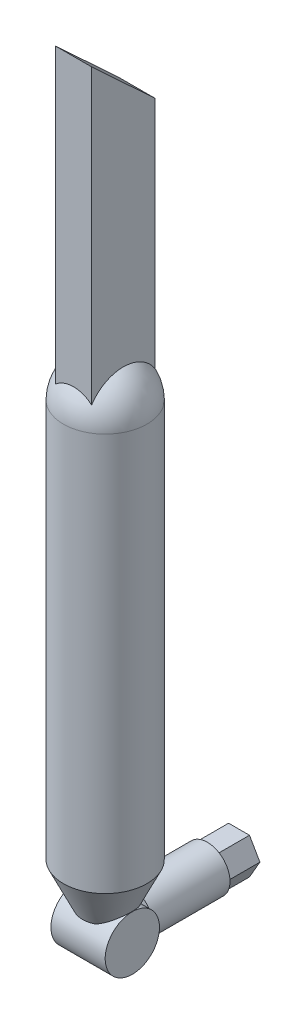
ISO-10303-21;
HEADER;
FILE_DESCRIPTION(('STEP AP214'),'2;1');
FILE_NAME('part.step','',(''),(''),'','','');
FILE_SCHEMA(('AUTOMOTIVE_DESIGN { 1 0 10303 214 1 1 1 1 }'));
ENDSEC;
DATA;
#1=APPLICATION_CONTEXT('core data for automotive mechanical design processes');
#2=APPLICATION_PROTOCOL_DEFINITION('international standard','automotive_design',2000,#1);
#3=PRODUCT_CONTEXT('',#1,'mechanical');
#4=PRODUCT('Part','Part','',(#3));
#5=PRODUCT_RELATED_PRODUCT_CATEGORY('part','',(#4));
#6=PRODUCT_DEFINITION_FORMATION('','',#4);
#7=PRODUCT_DEFINITION_CONTEXT('part definition',#1,'design');
#8=PRODUCT_DEFINITION('design','',#6,#7);
#9=PRODUCT_DEFINITION_SHAPE('','',#8);
#10=(LENGTH_UNIT() NAMED_UNIT(*) SI_UNIT(.MILLI.,.METRE.));
#11=(NAMED_UNIT(*) PLANE_ANGLE_UNIT() SI_UNIT($,.RADIAN.));
#12=(NAMED_UNIT(*) SI_UNIT($,.STERADIAN.) SOLID_ANGLE_UNIT());
#13=UNCERTAINTY_MEASURE_WITH_UNIT(LENGTH_MEASURE(1.E-05),#10,'distance_accuracy_value','');
#14=(GEOMETRIC_REPRESENTATION_CONTEXT(3) GLOBAL_UNCERTAINTY_ASSIGNED_CONTEXT((#13)) GLOBAL_UNIT_ASSIGNED_CONTEXT((#10,
#11,#12)) REPRESENTATION_CONTEXT('',''));
#15=CARTESIAN_POINT('',(0.,0.,0.));
#16=DIRECTION('',(0.,0.,1.));
#17=DIRECTION('',(1.,0.,0.));
#18=AXIS2_PLACEMENT_3D('',#15,#16,#17);
#19=CARTESIAN_POINT('',(0.,101.,29.6));
#20=DIRECTION('',(0.,-1.,0.));
#21=DIRECTION('',(0.,0.,1.));
#22=AXIS2_PLACEMENT_3D('',#19,#20,#21);
#23=SPHERICAL_SURFACE('',#22,9.25);
#24=CARTESIAN_POINT('',(0.,101.,29.6));
#25=DIRECTION('',(0.,-1.,0.));
#26=DIRECTION('',(0.,0.,-1.));
#27=AXIS2_PLACEMENT_3D('',#24,#25,#26);
#28=CIRCLE('',#27,9.25);
#29=CARTESIAN_POINT('',(0.,101.,20.35));
#30=VERTEX_POINT('',#29);
#31=EDGE_CURVE('E145',#30,#30,#28,.T.);
#32=ORIENTED_EDGE('',*,*,#31,.F.);
#33=EDGE_LOOP('',(#32));
#34=FACE_BOUND('',#33,.T.);
#35=CARTESIAN_POINT('',(4.,101.,29.6));
#36=DIRECTION('',(-1.,0.,0.));
#37=DIRECTION('',(0.,0.,1.));
#38=AXIS2_PLACEMENT_3D('',#35,#36,#37);
#39=CIRCLE('',#38,8.34041365880614);
#40=CARTESIAN_POINT('',(4.,105.534589286804,36.6));
#41=VERTEX_POINT('',#40);
#42=CARTESIAN_POINT('',(4.,105.534589286804,22.6));
#43=VERTEX_POINT('',#42);
#44=EDGE_CURVE('E12',#41,#43,#39,.T.);
#45=ORIENTED_EDGE('',*,*,#44,.F.);
#46=CARTESIAN_POINT('',(0.,101.,36.6));
#47=DIRECTION('',(0.,0.,-1.));
#48=DIRECTION('',(-1.,0.,0.));
#49=AXIS2_PLACEMENT_3D('',#46,#47,#48);
#50=CIRCLE('',#49,6.04669331122391);
#51=CARTESIAN_POINT('',(-4.,105.534589286804,36.6));
#52=VERTEX_POINT('',#51);
#53=EDGE_CURVE('E235',#52,#41,#50,.T.);
#54=ORIENTED_EDGE('',*,*,#53,.F.);
#55=CARTESIAN_POINT('',(-4.,101.,29.6));
#56=DIRECTION('',(-1.,0.,0.));
#57=DIRECTION('',(0.,0.,1.));
#58=AXIS2_PLACEMENT_3D('',#55,#56,#57);
#59=CIRCLE('',#58,8.34041365880614);
#60=CARTESIAN_POINT('',(-4.,105.534589286804,22.6));
#61=VERTEX_POINT('',#60);
#62=EDGE_CURVE('E231',#52,#61,#59,.T.);
#63=ORIENTED_EDGE('',*,*,#62,.T.);
#64=CARTESIAN_POINT('',(0.,101.,22.6));
#65=DIRECTION('',(0.,0.,1.));
#66=DIRECTION('',(1.,0.,0.));
#67=AXIS2_PLACEMENT_3D('',#64,#65,#66);
#68=CIRCLE('',#67,6.04669331122391);
#69=EDGE_CURVE('E65',#43,#61,#68,.T.);
#70=ORIENTED_EDGE('',*,*,#69,.F.);
#71=EDGE_LOOP('',(#45,#54,#63,#70));
#72=FACE_BOUND('',#71,.T.);
#73=ADVANCED_FACE('F55',(#34,#72),#23,.T.);
#74=CARTESIAN_POINT('',(6.,0.,29.6));
#75=DIRECTION('',(-1.,0.,0.));
#76=DIRECTION('',(0.,0.,1.));
#77=AXIS2_PLACEMENT_3D('',#74,#75,#76);
#78=CYLINDRICAL_SURFACE('',#77,6.);
#79=CARTESIAN_POINT('',(-6.,0.,29.6));
#80=DIRECTION('',(1.,0.,0.));
#81=DIRECTION('',(0.,0.,-1.));
#82=AXIS2_PLACEMENT_3D('',#79,#80,#81);
#83=CIRCLE('',#82,6.);
#84=CARTESIAN_POINT('',(-6.,0.,23.6));
#85=VERTEX_POINT('',#84);
#86=EDGE_CURVE('E168',#85,#85,#83,.T.);
#87=ORIENTED_EDGE('',*,*,#86,.T.);
#88=EDGE_LOOP('',(#87));
#89=FACE_BOUND('',#88,.T.);
#90=CARTESIAN_POINT('',(6.,0.,29.6));
#91=DIRECTION('',(1.,0.,0.));
#92=DIRECTION('',(0.,0.,-1.));
#93=AXIS2_PLACEMENT_3D('',#90,#91,#92);
#94=CIRCLE('',#93,6.);
#95=CARTESIAN_POINT('',(6.,0.,23.6));
#96=VERTEX_POINT('',#95);
#97=EDGE_CURVE('E163',#96,#96,#94,.T.);
#98=ORIENTED_EDGE('',*,*,#97,.F.);
#99=EDGE_LOOP('',(#98));
#100=FACE_BOUND('',#99,.T.);
#101=DIRECTION('',(-1.,0.,0.));
#102=VECTOR('',#101,1.);
#103=CARTESIAN_POINT('',(6.,2.15406592285379,24.));
#104=LINE('',#103,#102);
#105=CARTESIAN_POINT('',(-4.51220566907139,2.15406592285379,24.));
#106=VERTEX_POINT('',#105);
#107=CARTESIAN_POINT('',(4.51220566907139,2.15406592285379,24.));
#108=VERTEX_POINT('',#107);
#109=EDGE_CURVE('E210',#106,#108,#104,.F.);
#110=ORIENTED_EDGE('',*,*,#109,.F.);
#111=CARTESIAN_POINT('',(-4.51220566907139,2.15406592285379,24.));
#112=CARTESIAN_POINT('',(-4.55894658187828,2.05617724840622,23.9623344891867));
#113=CARTESIAN_POINT('',(-4.60281722188025,1.95606426604625,23.926784247778));
#114=CARTESIAN_POINT('',(-4.68438416390731,1.75175050764121,23.8604111204532));
#115=CARTESIAN_POINT('',(-4.72207599983695,1.64754684165553,23.8295916549995));
#116=CARTESIAN_POINT('',(-4.79086483458632,1.43530196514214,23.7731654255681));
#117=CARTESIAN_POINT('',(-4.8219458958981,1.32725219755523,23.7475712647783));
#118=CARTESIAN_POINT('',(-4.87695508746984,1.10817789116757,23.7021657472854));
#119=CARTESIAN_POINT('',(-4.90088492402655,0.997154068882254,23.6823530111491));
#120=CARTESIAN_POINT('',(-4.94131913491131,0.772314641589159,23.6488230902611));
#121=CARTESIAN_POINT('',(-4.95778924538453,0.658488636498177,23.6351340361495));
#122=CARTESIAN_POINT('',(-4.98286154880554,0.429381662830633,23.614278605395));
#123=CARTESIAN_POINT('',(-4.991464108371,0.314100762304129,23.6071119248182));
#124=CARTESIAN_POINT('',(-5.00064029656251,0.0832021547746377,23.5994669435459));
#125=CARTESIAN_POINT('',(-5.00122811739833,-0.0324145941765744,23.5989768202456));
#126=CARTESIAN_POINT('',(-4.99440040401746,-0.263238009526529,23.6046658352037));
#127=CARTESIAN_POINT('',(-4.98698551809346,-0.37844470838461,23.6108444332346));
#128=CARTESIAN_POINT('',(-4.9649413161458,-0.600940654284703,23.6291870249387));
#129=CARTESIAN_POINT('',(-4.95075141800852,-0.708304204611178,23.6409863700389));
#130=CARTESIAN_POINT('',(-4.91559267857415,-0.921190861293861,23.6701639870322));
#131=CARTESIAN_POINT('',(-4.89462093266647,-1.02671315861006,23.6875446493361));
#132=CARTESIAN_POINT('',(-4.84619877711982,-1.23523984362846,23.7275680529534));
#133=CARTESIAN_POINT('',(-4.81874798459369,-1.33824408212575,23.7502111052532));
#134=CARTESIAN_POINT('',(-4.75772175562083,-1.54120505179415,23.8003780647821));
#135=CARTESIAN_POINT('',(-4.72414614180932,-1.64116169461404,23.8279021133564));
#136=CARTESIAN_POINT('',(-4.66131589891433,-1.81049507105174,23.8791929387623));
#137=CARTESIAN_POINT('',(-4.63342213282214,-1.88070482916018,23.9019034310214));
#138=CARTESIAN_POINT('',(-4.57486420996215,-2.01896985863824,23.949416586012));
#139=CARTESIAN_POINT('',(-4.54420842076003,-2.08703084635873,23.9742129154828));
#140=CARTESIAN_POINT('',(-4.51220566907142,-2.1540659228538,24.));
#141=B_SPLINE_CURVE_WITH_KNOTS('',3,(#111,#112,#113,#114,#115,#116,#117,#118,#119,#120,#121,
#122,#123,#124,#125,#126,#127,#128,#129,#130,#131,#132,#133,#134,#135,#136,#137,#138,#139,#140),
.UNSPECIFIED.,.F.,.F.,(4,2,2,2,2,2,2,2,2,2,2,2,2,2,4),(0.,0.344460156339406,0.689168204131238,
1.0346980967844,1.38014547935627,1.72716386083323,2.07416607087935,2.42055374198497,
2.76691335461597,3.0933541686693,3.41993498026733,3.74653509639143,4.07314467182107,
4.30970661523619,4.54557455686185),.UNSPECIFIED.);
#142=CARTESIAN_POINT('',(-4.51220566907139,-2.15406592285379,24.));
#143=VERTEX_POINT('',#142);
#144=EDGE_CURVE('E167',#106,#143,#141,.T.);
#145=ORIENTED_EDGE('',*,*,#144,.T.);
#146=DIRECTION('',(-1.,0.,0.));
#147=VECTOR('',#146,1.);
#148=CARTESIAN_POINT('',(6.,-2.15406592285379,24.));
#149=LINE('',#148,#147);
#150=CARTESIAN_POINT('',(4.51220566907139,-2.15406592285379,24.));
#151=VERTEX_POINT('',#150);
#152=EDGE_CURVE('E296',#151,#143,#149,.T.);
#153=ORIENTED_EDGE('',*,*,#152,.F.);
#154=CARTESIAN_POINT('',(4.51220566907139,-2.15406592285379,24.));
#155=CARTESIAN_POINT('',(4.55894658187828,-2.05617724840622,23.9623344891867));
#156=CARTESIAN_POINT('',(4.60281722188025,-1.95606426604625,23.926784247778));
#157=CARTESIAN_POINT('',(4.68438416390731,-1.75175050764121,23.8604111204532));
#158=CARTESIAN_POINT('',(4.72207599983695,-1.64754684165553,23.8295916549995));
#159=CARTESIAN_POINT('',(4.79086483458632,-1.43530196514214,23.7731654255681));
#160=CARTESIAN_POINT('',(4.8219458958981,-1.32725219755523,23.7475712647783));
#161=CARTESIAN_POINT('',(4.87695508746984,-1.10817789116757,23.7021657472854));
#162=CARTESIAN_POINT('',(4.90088492402655,-0.997154068882254,23.6823530111491));
#163=CARTESIAN_POINT('',(4.94131913491131,-0.772314641589159,23.6488230902611));
#164=CARTESIAN_POINT('',(4.95778924538453,-0.658488636498177,23.6351340361495));
#165=CARTESIAN_POINT('',(4.98286154880554,-0.429381662830633,23.614278605395));
#166=CARTESIAN_POINT('',(4.991464108371,-0.314100762304129,23.6071119248182));
#167=CARTESIAN_POINT('',(5.00064029656251,-0.0832021547746377,23.5994669435459));
#168=CARTESIAN_POINT('',(5.00122811739833,0.0324145941765744,23.5989768202456));
#169=CARTESIAN_POINT('',(4.99440040401746,0.263238009526529,23.6046658352037));
#170=CARTESIAN_POINT('',(4.98698551809346,0.37844470838461,23.6108444332346));
#171=CARTESIAN_POINT('',(4.9649413161458,0.600940654284703,23.6291870249387));
#172=CARTESIAN_POINT('',(4.95075141800852,0.708304204611178,23.6409863700389));
#173=CARTESIAN_POINT('',(4.91559267857415,0.921190861293861,23.6701639870322));
#174=CARTESIAN_POINT('',(4.89462093266647,1.02671315861006,23.6875446493361));
#175=CARTESIAN_POINT('',(4.84619877711982,1.23523984362846,23.7275680529534));
#176=CARTESIAN_POINT('',(4.81874798459369,1.33824408212575,23.7502111052532));
#177=CARTESIAN_POINT('',(4.75772175562083,1.54120505179415,23.8003780647821));
#178=CARTESIAN_POINT('',(4.72414614180932,1.64116169461404,23.8279021133564));
#179=CARTESIAN_POINT('',(4.66131589891433,1.81049507105174,23.8791929387623));
#180=CARTESIAN_POINT('',(4.63342213282214,1.88070482916018,23.9019034310214));
#181=CARTESIAN_POINT('',(4.57486420996215,2.01896985863824,23.949416586012));
#182=CARTESIAN_POINT('',(4.54420842076003,2.08703084635873,23.9742129154828));
#183=CARTESIAN_POINT('',(4.51220566907142,2.1540659228538,24.));
#184=B_SPLINE_CURVE_WITH_KNOTS('',3,(#154,#155,#156,#157,#158,#159,#160,#161,#162,#163,#164,
#165,#166,#167,#168,#169,#170,#171,#172,#173,#174,#175,#176,#177,#178,#179,#180,#181,#182,#183),
.UNSPECIFIED.,.F.,.F.,(4,2,2,2,2,2,2,2,2,2,2,2,2,2,4),(0.,0.344460156339406,0.689168204131238,
1.0346980967844,1.38014547935627,1.72716386083323,2.07416607087935,2.42055374198497,
2.76691335461597,3.0933541686693,3.41993498026733,3.74653509639143,4.07314467182107,
4.30970661523619,4.54557455686185),.UNSPECIFIED.);
#185=EDGE_CURVE('E179',#151,#108,#184,.T.);
#186=ORIENTED_EDGE('',*,*,#185,.T.);
#187=EDGE_LOOP('',(#110,#145,#153,#186));
#188=FACE_BOUND('',#187,.T.);
#189=CARTESIAN_POINT('',(2.23549896096495,3.9998,34.0723148323883));
#190=CARTESIAN_POINT('',(2.32077695911365,4.0297727340832,34.0455087192463));
#191=CARTESIAN_POINT('',(2.40514867293773,4.06087838578132,34.0171472507727));
#192=CARTESIAN_POINT('',(2.57202345309472,4.12501601331814,33.9573118714882));
#193=CARTESIAN_POINT('',(2.65452675235518,4.15804774718422,33.9258383512984));
#194=CARTESIAN_POINT('',(2.89920490112097,4.25954433108321,33.8267270408121));
#195=CARTESIAN_POINT('',(3.05852368208579,4.33040183383517,33.7544061338386));
#196=CARTESIAN_POINT('',(3.37031402810598,4.47659133693451,33.5964755545473));
#197=CARTESIAN_POINT('',(3.52271293886908,4.55195724609816,33.5107544655088));
#198=CARTESIAN_POINT('',(3.81848905889785,4.70424290768612,33.3261793899309));
#199=CARTESIAN_POINT('',(3.96186865216539,4.78116224234469,33.2273288954559));
#200=CARTESIAN_POINT('',(4.20882583427235,4.9178134097646,33.0388344421946));
#201=CARTESIAN_POINT('',(4.31432127044238,4.97767634249664,32.9517984837724));
#202=CARTESIAN_POINT('',(4.51854129449492,5.09589781868021,32.7691756480427));
#203=CARTESIAN_POINT('',(4.61726419154319,5.15425598419775,32.6735866490073));
#204=CARTESIAN_POINT('',(4.90140395868331,5.32498040715015,32.3743690495578));
#205=CARTESIAN_POINT('',(5.07578193453171,5.4335569509897,32.1575484026198));
#206=CARTESIAN_POINT('',(5.34700421040212,5.60584011009224,31.7473137564259));
#207=CARTESIAN_POINT('',(5.45235135073301,5.6739960062222,31.5614355773967));
#208=CARTESIAN_POINT('',(5.59005994627605,5.76401087336521,31.2693098235971));
#209=CARTESIAN_POINT('',(5.63259005835426,5.79198784378392,31.1696751014314));
#210=CARTESIAN_POINT('',(5.71021949596007,5.84327661444368,30.9664143046666));
#211=CARTESIAN_POINT('',(5.74532225092089,5.86659056746617,30.8627900983705));
#212=CARTESIAN_POINT('',(5.80777966667446,5.90820641175384,30.6511150766422));
#213=CARTESIAN_POINT('',(5.83505650915663,5.92645790796374,30.5430312575172));
#214=CARTESIAN_POINT('',(5.88082842719612,5.95715055482269,30.3242569331868));
#215=CARTESIAN_POINT('',(5.89932806675235,5.96959472512886,30.2135678141923));
#216=CARTESIAN_POINT('',(5.92713468312164,5.98831922360297,29.9905706399691));
#217=CARTESIAN_POINT('',(5.93644590159506,5.99460239587031,29.8782633560521));
#218=CARTESIAN_POINT('',(5.94566272103673,6.00082176979776,29.6530960959905));
#219=CARTESIAN_POINT('',(5.94556956502471,6.00075881025548,29.5402361948599));
#220=CARTESIAN_POINT('',(5.93664937537803,5.99473978358574,29.3307392532896));
#221=CARTESIAN_POINT('',(5.92903627830118,5.98960281153037,29.2340245679092));
#222=CARTESIAN_POINT('',(5.90698776864724,5.97475072230426,29.0417219338285));
#223=CARTESIAN_POINT('',(5.89255026865776,5.9650342043688,28.946134339052));
#224=CARTESIAN_POINT('',(5.83933927872918,5.92930479163222,28.662115766321));
#225=CARTESIAN_POINT('',(5.79065946762815,5.89670662540619,28.4762586933838));
#226=CARTESIAN_POINT('',(5.66911099515966,5.81601743245621,28.1137406822301));
#227=CARTESIAN_POINT('',(5.59594806317048,5.76773814755615,27.937223444437));
#228=CARTESIAN_POINT('',(5.42921593394217,5.65905160977754,27.598288066676));
#229=CARTESIAN_POINT('',(5.33564290073514,5.59864207725437,27.4358725850898));
#230=CARTESIAN_POINT('',(5.07621753402394,5.43380527823193,27.0425523279098));
#231=CARTESIAN_POINT('',(4.8985921648198,5.32320311603824,26.8219190781896));
#232=CARTESIAN_POINT('',(4.60882038080533,5.14922886521492,26.5179187981851));
#233=CARTESIAN_POINT('',(4.50803812224498,5.08972129974374,26.4208525949438));
#234=CARTESIAN_POINT('',(4.29947609292952,4.96919131511184,26.2355797984152));
#235=CARTESIAN_POINT('',(4.19169835163956,4.90816933844316,26.1473706543465));
#236=CARTESIAN_POINT('',(3.94345948258987,4.77121839636627,25.9596705061593));
#237=CARTESIAN_POINT('',(3.80131677214171,4.69519209400643,25.8624778949338));
#238=CARTESIAN_POINT('',(3.50823961865649,4.54473866717709,25.6809119167985));
#239=CARTESIAN_POINT('',(3.35730312966443,4.47031192041726,25.5965415497132));
#240=CARTESIAN_POINT('',(3.04880233696912,4.32603490676154,25.4410884625336));
#241=CARTESIAN_POINT('',(2.89131688152684,4.25614713401708,25.3698843559733));
#242=CARTESIAN_POINT('',(2.56888896921659,4.12265307786046,25.2396728734774));
#243=CARTESIAN_POINT('',(2.4039485462212,4.05904509608929,25.1806621951048));
#244=CARTESIAN_POINT('',(2.23549896096495,3.9998,25.1276851676118));
#245=B_SPLINE_CURVE_WITH_KNOTS('',3,(#189,#190,#191,#192,#193,#194,#195,#196,#197,#198,#199,
#200,#201,#202,#203,#204,#205,#206,#207,#208,#209,#210,#211,#212,#213,#214,#215,#216,#217,#218,
#219,#220,#221,#222,#223,#224,#225,#226,#227,#228,#229,#230,#231,#232,#233,#234,#235,#236,#237,
#238,#239,#240,#241,#242,#243,#244),.UNSPECIFIED.,.F.,.F.,(4,2,2,2,2,2,2,2,2,2,2,2,2,2,2,2,2,2,
2,2,2,2,2,2,2,2,2,4),(0.,0.282793787819684,0.565552124639248,1.13114935901986,1.70172743206057,
2.27215404963195,2.71963038386059,3.16721803163293,4.05835986345071,4.72844205791103,
5.06374437188509,5.3988915272518,5.73726411444646,6.07546056019066,6.41350081082274,
6.75149638116845,7.04258280998519,7.33375833245658,7.91560422162818,8.50471093131596,
9.09392845596651,10.0007460951063,10.4566131780949,10.9123485951793,11.4763552173151,
12.0404935889962,12.5991387645612,13.1576324391966),.UNSPECIFIED.);
#246=CARTESIAN_POINT('',(2.23606797749979,4.,34.0721359549996));
#247=VERTEX_POINT('',#246);
#248=CARTESIAN_POINT('',(2.23606797749979,4.,25.1278640450004));
#249=VERTEX_POINT('',#248);
#250=EDGE_CURVE('E224',#247,#249,#245,.T.);
#251=ORIENTED_EDGE('',*,*,#250,.F.);
#252=DIRECTION('',(-1.,0.,0.));
#253=VECTOR('',#252,1.);
#254=CARTESIAN_POINT('',(6.,4.,34.0721359549996));
#255=LINE('',#254,#253);
#256=CARTESIAN_POINT('',(-2.23606797749979,4.,34.0721359549996));
#257=VERTEX_POINT('',#256);
#258=EDGE_CURVE('E209',#257,#247,#255,.F.);
#259=ORIENTED_EDGE('',*,*,#258,.F.);
#260=CARTESIAN_POINT('',(-2.23549896096493,3.9998,25.1276851676117));
#261=CARTESIAN_POINT('',(-2.32077695911364,4.0297727340832,25.1544912807537));
#262=CARTESIAN_POINT('',(-2.40514867293772,4.06087838578131,25.1828527492273));
#263=CARTESIAN_POINT('',(-2.57202345309471,4.12501601331813,25.2426881285118));
#264=CARTESIAN_POINT('',(-2.65452675235516,4.15804774718422,25.2741616487016));
#265=CARTESIAN_POINT('',(-2.89920490112096,4.25954433108321,25.3732729591879));
#266=CARTESIAN_POINT('',(-3.05852368208578,4.33040183383516,25.4455938661613));
#267=CARTESIAN_POINT('',(-3.37031402810597,4.47659133693451,25.6035244454527));
#268=CARTESIAN_POINT('',(-3.52271293886907,4.55195724609815,25.6892455344912));
#269=CARTESIAN_POINT('',(-3.81848905889784,4.70424290768611,25.8738206100691));
#270=CARTESIAN_POINT('',(-3.96186865216538,4.78116224234469,25.9726711045441));
#271=CARTESIAN_POINT('',(-4.20882583427234,4.91781340976459,26.1611655578054));
#272=CARTESIAN_POINT('',(-4.31432127044238,4.97767634249663,26.2482015162276));
#273=CARTESIAN_POINT('',(-4.51854129449492,5.0958978186802,26.4308243519573));
#274=CARTESIAN_POINT('',(-4.61726419154319,5.15425598419774,26.5264133509927));
#275=CARTESIAN_POINT('',(-4.90140395868331,5.32498040715015,26.8256309504421));
#276=CARTESIAN_POINT('',(-5.07578193453171,5.43355695098969,27.0424515973802));
#277=CARTESIAN_POINT('',(-5.34700421040211,5.60584011009223,27.4526862435741));
#278=CARTESIAN_POINT('',(-5.452351350733,5.6739960062222,27.6385644226033));
#279=CARTESIAN_POINT('',(-5.59005994627605,5.76401087336521,27.9306901764029));
#280=CARTESIAN_POINT('',(-5.63259005835426,5.79198784378392,28.0303248985686));
#281=CARTESIAN_POINT('',(-5.71021949596007,5.84327661444368,28.2335856953334));
#282=CARTESIAN_POINT('',(-5.74532225092089,5.86659056746617,28.3372099016295));
#283=CARTESIAN_POINT('',(-5.80777966667445,5.90820641175384,28.5488849233578));
#284=CARTESIAN_POINT('',(-5.83505650915662,5.92645790796374,28.6569687424828));
#285=CARTESIAN_POINT('',(-5.88082842719612,5.95715055482269,28.8757430668132));
#286=CARTESIAN_POINT('',(-5.89932806675235,5.96959472512886,28.9864321858077));
#287=CARTESIAN_POINT('',(-5.92713468312164,5.98831922360297,29.2094293600309));
#288=CARTESIAN_POINT('',(-5.93644590159506,5.99460239587031,29.3217366439479));
#289=CARTESIAN_POINT('',(-5.94566272103673,6.00082176979776,29.5469039040095));
#290=CARTESIAN_POINT('',(-5.94556956502471,6.00075881025548,29.6597638051401));
#291=CARTESIAN_POINT('',(-5.93664937537803,5.99473978358574,29.8692607467103));
#292=CARTESIAN_POINT('',(-5.92903627830118,5.98960281153037,29.9659754320908));
#293=CARTESIAN_POINT('',(-5.90698776864724,5.97475072230426,30.1582780661715));
#294=CARTESIAN_POINT('',(-5.89255026865776,5.9650342043688,30.253865660948));
#295=CARTESIAN_POINT('',(-5.83933927872918,5.92930479163222,30.537884233679));
#296=CARTESIAN_POINT('',(-5.79065946762815,5.89670662540619,30.7237413066162));
#297=CARTESIAN_POINT('',(-5.66911099515966,5.81601743245621,31.0862593177699));
#298=CARTESIAN_POINT('',(-5.59594806317048,5.76773814755615,31.262776555563));
#299=CARTESIAN_POINT('',(-5.42921593394217,5.65905160977754,31.601711933324));
#300=CARTESIAN_POINT('',(-5.33564290073514,5.59864207725437,31.7641274149102));
#301=CARTESIAN_POINT('',(-5.07621753402394,5.43380527823193,32.1574476720902));
#302=CARTESIAN_POINT('',(-4.89859216481981,5.32320311603824,32.3780809218104));
#303=CARTESIAN_POINT('',(-4.60882038080533,5.14922886521493,32.6820812018149));
#304=CARTESIAN_POINT('',(-4.50803812224498,5.08972129974375,32.7791474050562));
#305=CARTESIAN_POINT('',(-4.29947609292952,4.96919131511184,32.9644202015848));
#306=CARTESIAN_POINT('',(-4.19169835163956,4.90816933844316,33.0526293456535));
#307=CARTESIAN_POINT('',(-3.94345948258987,4.77121839636627,33.2403294938407));
#308=CARTESIAN_POINT('',(-3.80131677214172,4.69519209400643,33.3375221050662));
#309=CARTESIAN_POINT('',(-3.50823961865649,4.54473866717709,33.5190880832015));
#310=CARTESIAN_POINT('',(-3.35730312966443,4.47031192041726,33.6034584502868));
#311=CARTESIAN_POINT('',(-3.04880233696912,4.32603490676154,33.7589115374664));
#312=CARTESIAN_POINT('',(-2.89131688152684,4.25614713401708,33.8301156440267));
#313=CARTESIAN_POINT('',(-2.56888896921659,4.12265307786045,33.9603271265226));
#314=CARTESIAN_POINT('',(-2.40394854622119,4.05904509608929,34.0193378048952));
#315=CARTESIAN_POINT('',(-2.23549896096494,3.9998,34.0723148323883));
#316=B_SPLINE_CURVE_WITH_KNOTS('',3,(#260,#261,#262,#263,#264,#265,#266,#267,#268,#269,#270,
#271,#272,#273,#274,#275,#276,#277,#278,#279,#280,#281,#282,#283,#284,#285,#286,#287,#288,#289,
#290,#291,#292,#293,#294,#295,#296,#297,#298,#299,#300,#301,#302,#303,#304,#305,#306,#307,#308,
#309,#310,#311,#312,#313,#314,#315),.UNSPECIFIED.,.F.,.F.,(4,2,2,2,2,2,2,2,2,2,2,2,2,2,2,2,2,2,
2,2,2,2,2,2,2,2,2,4),(0.,0.282793787819682,0.565552124639245,1.13114935901986,1.70172743206057,
2.27215404963195,2.71963038386059,3.16721803163293,4.05835986345071,4.72844205791103,
5.0637443718851,5.39889152725181,5.73726411444646,6.07546056019066,6.41350081082275,
6.75149638116846,7.0425828099852,7.33375833245659,7.91560422162819,8.50471093131596,
9.09392845596652,10.0007460951063,10.4566131780949,10.9123485951793,11.4763552173152,
12.0404935889962,12.5991387645612,13.1576324391966),.UNSPECIFIED.);
#317=CARTESIAN_POINT('',(-2.23606797749979,4.,25.1278640450004));
#318=VERTEX_POINT('',#317);
#319=EDGE_CURVE('E199',#318,#257,#316,.T.);
#320=ORIENTED_EDGE('',*,*,#319,.F.);
#321=DIRECTION('',(-1.,0.,0.));
#322=VECTOR('',#321,1.);
#323=CARTESIAN_POINT('',(6.,4.,25.1278640450004));
#324=LINE('',#323,#322);
#325=EDGE_CURVE('E80',#249,#318,#324,.T.);
#326=ORIENTED_EDGE('',*,*,#325,.F.);
#327=EDGE_LOOP('',(#251,#259,#320,#326));
#328=FACE_BOUND('',#327,.T.);
#329=ADVANCED_FACE('F185',(#89,#100,#188,#328),#78,.T.);
#330=CARTESIAN_POINT('',(0.,0.,24.));
#331=DIRECTION('',(0.,0.,-1.));
#332=DIRECTION('',(-1.,0.,0.));
#333=AXIS2_PLACEMENT_3D('',#330,#331,#332);
#334=CYLINDRICAL_SURFACE('',#333,5.);
#335=CARTESIAN_POINT('',(0.,0.,7.));
#336=DIRECTION('',(0.,0.,1.));
#337=DIRECTION('',(1.,0.,0.));
#338=AXIS2_PLACEMENT_3D('',#335,#336,#337);
#339=CIRCLE('',#338,5.);
#340=CARTESIAN_POINT('',(5.,0.,7.));
#341=VERTEX_POINT('',#340);
#342=EDGE_CURVE('E286',#341,#341,#339,.T.);
#343=ORIENTED_EDGE('',*,*,#342,.T.);
#344=EDGE_LOOP('',(#343));
#345=FACE_BOUND('',#344,.T.);
#346=ORIENTED_EDGE('',*,*,#185,.F.);
#347=CARTESIAN_POINT('',(0.,0.,24.));
#348=DIRECTION('',(0.,0.,1.));
#349=DIRECTION('',(1.,0.,0.));
#350=AXIS2_PLACEMENT_3D('',#347,#348,#349);
#351=CIRCLE('',#350,5.);
#352=EDGE_CURVE('E289',#143,#151,#351,.T.);
#353=ORIENTED_EDGE('',*,*,#352,.F.);
#354=ORIENTED_EDGE('',*,*,#144,.F.);
#355=EDGE_CURVE('E293',#108,#106,#351,.T.);
#356=ORIENTED_EDGE('',*,*,#355,.F.);
#357=EDGE_LOOP('',(#346,#353,#354,#356));
#358=FACE_BOUND('',#357,.T.);
#359=ADVANCED_FACE('F57',(#345,#358),#334,.T.);
#360=CARTESIAN_POINT('',(0.,0.,24.));
#361=DIRECTION('',(0.,0.,1.));
#362=DIRECTION('',(1.,0.,0.));
#363=AXIS2_PLACEMENT_3D('',#360,#361,#362);
#364=PLANE('',#363);
#365=ORIENTED_EDGE('',*,*,#355,.T.);
#366=ORIENTED_EDGE('',*,*,#109,.T.);
#367=EDGE_LOOP('',(#365,#366));
#368=FACE_BOUND('',#367,.T.);
#369=ADVANCED_FACE('F193',(#368),#364,.T.);
#370=ORIENTED_EDGE('',*,*,#352,.T.);
#371=ORIENTED_EDGE('',*,*,#152,.T.);
#372=EDGE_LOOP('',(#370,#371));
#373=FACE_BOUND('',#372,.T.);
#374=ADVANCED_FACE('F326',(#373),#364,.T.);
#375=CARTESIAN_POINT('',(0.,0.,7.));
#376=DIRECTION('',(0.,0.,1.));
#377=DIRECTION('',(1.,0.,0.));
#378=AXIS2_PLACEMENT_3D('',#375,#376,#377);
#379=PLANE('',#378);
#380=ORIENTED_EDGE('',*,*,#342,.F.);
#381=EDGE_LOOP('',(#380));
#382=FACE_BOUND('',#381,.T.);
#383=ADVANCED_FACE('F313',(#382),#379,.F.);
#384=CARTESIAN_POINT('',(6.,0.,29.6));
#385=DIRECTION('',(1.,0.,0.));
#386=DIRECTION('',(0.,0.,-1.));
#387=AXIS2_PLACEMENT_3D('',#384,#385,#386);
#388=PLANE('',#387);
#389=ORIENTED_EDGE('',*,*,#97,.T.);
#390=EDGE_LOOP('',(#389));
#391=FACE_BOUND('',#390,.T.);
#392=ADVANCED_FACE('F308',(#391),#388,.T.);
#393=CARTESIAN_POINT('',(-6.,0.,29.6));
#394=DIRECTION('',(1.,0.,0.));
#395=DIRECTION('',(0.,0.,-1.));
#396=AXIS2_PLACEMENT_3D('',#393,#394,#395);
#397=PLANE('',#396);
#398=ORIENTED_EDGE('',*,*,#86,.F.);
#399=EDGE_LOOP('',(#398));
#400=FACE_BOUND('',#399,.T.);
#401=ADVANCED_FACE('F191',(#400),#397,.F.);
#402=CARTESIAN_POINT('',(0.,4.,29.6));
#403=DIRECTION('',(0.,1.,0.));
#404=DIRECTION('',(0.,0.,1.));
#405=AXIS2_PLACEMENT_3D('',#402,#403,#404);
#406=PLANE('',#405);
#407=CARTESIAN_POINT('',(0.,4.,29.6));
#408=DIRECTION('',(0.,-1.,0.));
#409=DIRECTION('',(0.,0.,-1.));
#410=AXIS2_PLACEMENT_3D('',#407,#408,#409);
#411=CIRCLE('',#410,5.);
#412=EDGE_CURVE('E158',#318,#249,#411,.T.);
#413=ORIENTED_EDGE('',*,*,#412,.T.);
#414=ORIENTED_EDGE('',*,*,#325,.T.);
#415=EDGE_LOOP('',(#413,#414));
#416=FACE_BOUND('',#415,.T.);
#417=ADVANCED_FACE('F222',(#416),#406,.F.);
#418=EDGE_CURVE('E162',#247,#257,#411,.T.);
#419=ORIENTED_EDGE('',*,*,#418,.T.);
#420=ORIENTED_EDGE('',*,*,#258,.T.);
#421=EDGE_LOOP('',(#419,#420));
#422=FACE_BOUND('',#421,.T.);
#423=ADVANCED_FACE('F219',(#422),#406,.F.);
#424=CARTESIAN_POINT('',(0.,13.,29.6));
#425=DIRECTION('',(0.,1.,0.));
#426=DIRECTION('',(0.,0.,1.));
#427=AXIS2_PLACEMENT_3D('',#424,#425,#426);
#428=CONICAL_SURFACE('',#427,9.25,0.441179480414981);
#429=CARTESIAN_POINT('',(0.,13.,29.6));
#430=DIRECTION('',(0.,-1.,0.));
#431=DIRECTION('',(0.,0.,-1.));
#432=AXIS2_PLACEMENT_3D('',#429,#430,#431);
#433=CIRCLE('',#432,9.25);
#434=CARTESIAN_POINT('',(0.,13.,20.35));
#435=VERTEX_POINT('',#434);
#436=EDGE_CURVE('E150',#435,#435,#433,.T.);
#437=ORIENTED_EDGE('',*,*,#436,.T.);
#438=EDGE_LOOP('',(#437));
#439=FACE_BOUND('',#438,.T.);
#440=ORIENTED_EDGE('',*,*,#418,.F.);
#441=ORIENTED_EDGE('',*,*,#250,.T.);
#442=ORIENTED_EDGE('',*,*,#412,.F.);
#443=ORIENTED_EDGE('',*,*,#319,.T.);
#444=EDGE_LOOP('',(#440,#441,#442,#443));
#445=FACE_BOUND('',#444,.T.);
#446=ADVANCED_FACE('F213',(#439,#445),#428,.T.);
#447=CARTESIAN_POINT('',(0.,2.,29.6));
#448=DIRECTION('',(0.,-1.,0.));
#449=DIRECTION('',(0.,0.,-1.));
#450=AXIS2_PLACEMENT_3D('',#447,#448,#449);
#451=CYLINDRICAL_SURFACE('',#450,9.25);
#452=ORIENTED_EDGE('',*,*,#436,.F.);
#453=EDGE_LOOP('',(#452));
#454=FACE_BOUND('',#453,.T.);
#455=ORIENTED_EDGE('',*,*,#31,.T.);
#456=EDGE_LOOP('',(#455));
#457=FACE_BOUND('',#456,.T.);
#458=ADVANCED_FACE('F218',(#454,#457),#451,.T.);
#459=CARTESIAN_POINT('',(4.,157.3,22.6));
#460=DIRECTION('',(0.,0.,1.));
#461=DIRECTION('',(1.,0.,0.));
#462=AXIS2_PLACEMENT_3D('',#459,#460,#461);
#463=PLANE('',#462);
#464=DIRECTION('',(0.,1.,0.));
#465=VECTOR('',#464,1.);
#466=CARTESIAN_POINT('',(4.,157.3,22.6));
#467=LINE('',#466,#465);
#468=CARTESIAN_POINT('',(4.,157.3,22.6));
#469=VERTEX_POINT('',#468);
#470=EDGE_CURVE('E120',#43,#469,#467,.T.);
#471=ORIENTED_EDGE('',*,*,#470,.F.);
#472=ORIENTED_EDGE('',*,*,#69,.T.);
#473=DIRECTION('',(0.,1.,0.));
#474=VECTOR('',#473,1.);
#475=CARTESIAN_POINT('',(-4.,157.3,22.6));
#476=LINE('',#475,#474);
#477=CARTESIAN_POINT('',(-4.,157.3,22.6));
#478=VERTEX_POINT('',#477);
#479=EDGE_CURVE('E72',#61,#478,#476,.T.);
#480=ORIENTED_EDGE('',*,*,#479,.T.);
#481=DIRECTION('',(-1.,0.,0.));
#482=VECTOR('',#481,1.);
#483=CARTESIAN_POINT('',(4.,157.3,22.6));
#484=LINE('',#483,#482);
#485=EDGE_CURVE('E136',#469,#478,#484,.T.);
#486=ORIENTED_EDGE('',*,*,#485,.F.);
#487=EDGE_LOOP('',(#471,#472,#480,#486));
#488=FACE_BOUND('',#487,.T.);
#489=ADVANCED_FACE('F143',(#488),#463,.F.);
#490=CARTESIAN_POINT('',(4.,170.3,36.6));
#491=DIRECTION('',(0.,-0.7327934916263,0.680451099367277));
#492=DIRECTION('',(0.,-0.680451099367277,-0.7327934916263));
#493=AXIS2_PLACEMENT_3D('',#490,#491,#492);
#494=PLANE('',#493);
#495=DIRECTION('',(0.,0.680451099367277,0.7327934916263));
#496=VECTOR('',#495,1.);
#497=CARTESIAN_POINT('',(-4.,170.3,36.6));
#498=LINE('',#497,#496);
#499=CARTESIAN_POINT('',(-4.,170.3,36.6));
#500=VERTEX_POINT('',#499);
#501=EDGE_CURVE('E246',#478,#500,#498,.T.);
#502=ORIENTED_EDGE('',*,*,#501,.T.);
#503=DIRECTION('',(-1.,0.,0.));
#504=VECTOR('',#503,1.);
#505=CARTESIAN_POINT('',(4.,170.3,36.6));
#506=LINE('',#505,#504);
#507=CARTESIAN_POINT('',(4.,170.3,36.6));
#508=VERTEX_POINT('',#507);
#509=EDGE_CURVE('E138',#508,#500,#506,.T.);
#510=ORIENTED_EDGE('',*,*,#509,.F.);
#511=DIRECTION('',(0.,0.680451099367277,0.7327934916263));
#512=VECTOR('',#511,1.);
#513=CARTESIAN_POINT('',(4.,170.3,36.6));
#514=LINE('',#513,#512);
#515=EDGE_CURVE('E124',#469,#508,#514,.T.);
#516=ORIENTED_EDGE('',*,*,#515,.F.);
#517=ORIENTED_EDGE('',*,*,#485,.T.);
#518=EDGE_LOOP('',(#502,#510,#516,#517));
#519=FACE_BOUND('',#518,.T.);
#520=ADVANCED_FACE('F135',(#519),#494,.F.);
#521=CARTESIAN_POINT('',(4.,95.,36.6));
#522=DIRECTION('',(0.,0.,-1.));
#523=DIRECTION('',(-1.,0.,0.));
#524=AXIS2_PLACEMENT_3D('',#521,#522,#523);
#525=PLANE('',#524);
#526=DIRECTION('',(0.,-1.,0.));
#527=VECTOR('',#526,1.);
#528=CARTESIAN_POINT('',(-4.,95.,36.6));
#529=LINE('',#528,#527);
#530=EDGE_CURVE('E131',#500,#52,#529,.T.);
#531=ORIENTED_EDGE('',*,*,#530,.T.);
#532=ORIENTED_EDGE('',*,*,#53,.T.);
#533=DIRECTION('',(0.,-1.,0.));
#534=VECTOR('',#533,1.);
#535=CARTESIAN_POINT('',(4.,95.,36.6));
#536=LINE('',#535,#534);
#537=EDGE_CURVE('E141',#508,#41,#536,.T.);
#538=ORIENTED_EDGE('',*,*,#537,.F.);
#539=ORIENTED_EDGE('',*,*,#509,.T.);
#540=EDGE_LOOP('',(#531,#532,#538,#539));
#541=FACE_BOUND('',#540,.T.);
#542=ADVANCED_FACE('F244',(#541),#525,.F.);
#543=CARTESIAN_POINT('',(4.,0.,0.));
#544=DIRECTION('',(-1.,0.,0.));
#545=DIRECTION('',(0.,0.,1.));
#546=AXIS2_PLACEMENT_3D('',#543,#544,#545);
#547=PLANE('',#546);
#548=ORIENTED_EDGE('',*,*,#537,.T.);
#549=ORIENTED_EDGE('',*,*,#44,.T.);
#550=ORIENTED_EDGE('',*,*,#470,.T.);
#551=ORIENTED_EDGE('',*,*,#515,.T.);
#552=EDGE_LOOP('',(#548,#549,#550,#551));
#553=FACE_BOUND('',#552,.T.);
#554=ADVANCED_FACE('F123',(#553),#547,.F.);
#555=CARTESIAN_POINT('',(-4.,0.,0.));
#556=DIRECTION('',(-1.,0.,0.));
#557=DIRECTION('',(0.,0.,1.));
#558=AXIS2_PLACEMENT_3D('',#555,#556,#557);
#559=PLANE('',#558);
#560=ORIENTED_EDGE('',*,*,#62,.F.);
#561=ORIENTED_EDGE('',*,*,#530,.F.);
#562=ORIENTED_EDGE('',*,*,#501,.F.);
#563=ORIENTED_EDGE('',*,*,#479,.F.);
#564=EDGE_LOOP('',(#560,#561,#562,#563));
#565=FACE_BOUND('',#564,.T.);
#566=ADVANCED_FACE('F242',(#565),#559,.T.);
#567=CLOSED_SHELL('',(#73,#329,#359,#369,#374,#383,#392,#401,#417,#423,#446,#458,#489,#520,#542,
#554,#566));
#568=MANIFOLD_SOLID_BREP('B2',#567);
#569=CARTESIAN_POINT('',(2.3094010767585,-4.,7.));
#570=DIRECTION('',(-0.866025403784438,0.5,0.));
#571=DIRECTION('',(-0.5,-0.866025403784439,0.));
#572=AXIS2_PLACEMENT_3D('',#569,#570,#571);
#573=PLANE('',#572);
#574=DIRECTION('',(0.5,0.866025403784438,0.));
#575=VECTOR('',#574,1.);
#576=CARTESIAN_POINT('',(2.3094010767585,-4.,0.));
#577=LINE('',#576,#575);
#578=CARTESIAN_POINT('',(2.3094010767585,-4.,0.));
#579=VERTEX_POINT('',#578);
#580=CARTESIAN_POINT('',(4.61880215351701,0.,0.));
#581=VERTEX_POINT('',#580);
#582=EDGE_CURVE('E547',#579,#581,#577,.T.);
#583=ORIENTED_EDGE('',*,*,#582,.T.);
#584=DIRECTION('',(0.,0.,-1.));
#585=VECTOR('',#584,1.);
#586=CARTESIAN_POINT('',(4.61880215351701,0.,7.));
#587=LINE('',#586,#585);
#588=CARTESIAN_POINT('',(4.61880215351701,0.,7.));
#589=VERTEX_POINT('',#588);
#590=EDGE_CURVE('E53',#589,#581,#587,.T.);
#591=ORIENTED_EDGE('',*,*,#590,.F.);
#592=DIRECTION('',(0.5,0.866025403784438,0.));
#593=VECTOR('',#592,1.);
#594=CARTESIAN_POINT('',(2.3094010767585,-4.,7.));
#595=LINE('',#594,#593);
#596=CARTESIAN_POINT('',(2.3094010767585,-4.,7.));
#597=VERTEX_POINT('',#596);
#598=EDGE_CURVE('E558',#597,#589,#595,.T.);
#599=ORIENTED_EDGE('',*,*,#598,.F.);
#600=DIRECTION('',(0.,0.,-1.));
#601=VECTOR('',#600,1.);
#602=CARTESIAN_POINT('',(2.3094010767585,-4.,7.));
#603=LINE('',#602,#601);
#604=EDGE_CURVE('E543',#597,#579,#603,.T.);
#605=ORIENTED_EDGE('',*,*,#604,.T.);
#606=EDGE_LOOP('',(#583,#591,#599,#605));
#607=FACE_BOUND('',#606,.T.);
#608=ADVANCED_FACE('F463',(#607),#573,.F.);
#609=CARTESIAN_POINT('',(4.61880215351701,0.,7.));
#610=DIRECTION('',(-0.866025403784439,-0.5,0.));
#611=DIRECTION('',(0.5,-0.866025403784439,0.));
#612=AXIS2_PLACEMENT_3D('',#609,#610,#611);
#613=PLANE('',#612);
#614=DIRECTION('',(-0.5,0.866025403784439,0.));
#615=VECTOR('',#614,1.);
#616=CARTESIAN_POINT('',(4.61880215351701,0.,0.));
#617=LINE('',#616,#615);
#618=CARTESIAN_POINT('',(2.3094010767585,4.,0.));
#619=VERTEX_POINT('',#618);
#620=EDGE_CURVE('E550',#581,#619,#617,.T.);
#621=ORIENTED_EDGE('',*,*,#620,.T.);
#622=DIRECTION('',(0.,0.,-1.));
#623=VECTOR('',#622,1.);
#624=CARTESIAN_POINT('',(2.3094010767585,4.,7.));
#625=LINE('',#624,#623);
#626=CARTESIAN_POINT('',(2.3094010767585,4.,7.));
#627=VERTEX_POINT('',#626);
#628=EDGE_CURVE('E471',#627,#619,#625,.T.);
#629=ORIENTED_EDGE('',*,*,#628,.F.);
#630=DIRECTION('',(-0.5,0.866025403784439,0.));
#631=VECTOR('',#630,1.);
#632=CARTESIAN_POINT('',(4.61880215351701,0.,7.));
#633=LINE('',#632,#631);
#634=EDGE_CURVE('E516',#589,#627,#633,.T.);
#635=ORIENTED_EDGE('',*,*,#634,.F.);
#636=ORIENTED_EDGE('',*,*,#590,.T.);
#637=EDGE_LOOP('',(#621,#629,#635,#636));
#638=FACE_BOUND('',#637,.T.);
#639=ADVANCED_FACE('F582',(#638),#613,.F.);
#640=CARTESIAN_POINT('',(2.3094010767585,4.,7.));
#641=DIRECTION('',(0.,-1.,0.));
#642=DIRECTION('',(1.,0.,0.));
#643=AXIS2_PLACEMENT_3D('',#640,#641,#642);
#644=PLANE('',#643);
#645=DIRECTION('',(-1.,0.,0.));
#646=VECTOR('',#645,1.);
#647=CARTESIAN_POINT('',(2.3094010767585,4.,0.));
#648=LINE('',#647,#646);
#649=CARTESIAN_POINT('',(-2.3094010767585,4.,0.));
#650=VERTEX_POINT('',#649);
#651=EDGE_CURVE('E553',#619,#650,#648,.T.);
#652=ORIENTED_EDGE('',*,*,#651,.T.);
#653=DIRECTION('',(0.,0.,-1.));
#654=VECTOR('',#653,1.);
#655=CARTESIAN_POINT('',(-2.3094010767585,4.,7.));
#656=LINE('',#655,#654);
#657=CARTESIAN_POINT('',(-2.3094010767585,4.,7.));
#658=VERTEX_POINT('',#657);
#659=EDGE_CURVE('E538',#658,#650,#656,.T.);
#660=ORIENTED_EDGE('',*,*,#659,.F.);
#661=DIRECTION('',(-1.,0.,0.));
#662=VECTOR('',#661,1.);
#663=CARTESIAN_POINT('',(2.3094010767585,4.,7.));
#664=LINE('',#663,#662);
#665=EDGE_CURVE('E529',#627,#658,#664,.T.);
#666=ORIENTED_EDGE('',*,*,#665,.F.);
#667=ORIENTED_EDGE('',*,*,#628,.T.);
#668=EDGE_LOOP('',(#652,#660,#666,#667));
#669=FACE_BOUND('',#668,.T.);
#670=ADVANCED_FACE('F564',(#669),#644,.F.);
#671=CARTESIAN_POINT('',(-2.3094010767585,4.,7.));
#672=DIRECTION('',(0.866025403784438,-0.5,0.));
#673=DIRECTION('',(0.5,0.866025403784439,0.));
#674=AXIS2_PLACEMENT_3D('',#671,#672,#673);
#675=PLANE('',#674);
#676=DIRECTION('',(-0.5,-0.866025403784439,0.));
#677=VECTOR('',#676,1.);
#678=CARTESIAN_POINT('',(-2.3094010767585,4.,0.));
#679=LINE('',#678,#677);
#680=CARTESIAN_POINT('',(-4.61880215351701,0.,0.));
#681=VERTEX_POINT('',#680);
#682=EDGE_CURVE('E537',#650,#681,#679,.T.);
#683=ORIENTED_EDGE('',*,*,#682,.T.);
#684=DIRECTION('',(0.,0.,-1.));
#685=VECTOR('',#684,1.);
#686=CARTESIAN_POINT('',(-4.61880215351701,0.,7.));
#687=LINE('',#686,#685);
#688=CARTESIAN_POINT('',(-4.61880215351701,0.,7.));
#689=VERTEX_POINT('',#688);
#690=EDGE_CURVE('E534',#689,#681,#687,.T.);
#691=ORIENTED_EDGE('',*,*,#690,.F.);
#692=DIRECTION('',(-0.5,-0.866025403784439,0.));
#693=VECTOR('',#692,1.);
#694=CARTESIAN_POINT('',(-2.3094010767585,4.,7.));
#695=LINE('',#694,#693);
#696=EDGE_CURVE('E523',#658,#689,#695,.T.);
#697=ORIENTED_EDGE('',*,*,#696,.F.);
#698=ORIENTED_EDGE('',*,*,#659,.T.);
#699=EDGE_LOOP('',(#683,#691,#697,#698));
#700=FACE_BOUND('',#699,.T.);
#701=ADVANCED_FACE('F535',(#700),#675,.F.);
#702=CARTESIAN_POINT('',(-4.61880215351701,0.,7.));
#703=DIRECTION('',(0.866025403784439,0.5,0.));
#704=DIRECTION('',(-0.5,0.866025403784439,0.));
#705=AXIS2_PLACEMENT_3D('',#702,#703,#704);
#706=PLANE('',#705);
#707=DIRECTION('',(0.5,-0.866025403784439,0.));
#708=VECTOR('',#707,1.);
#709=CARTESIAN_POINT('',(-4.61880215351701,0.,0.));
#710=LINE('',#709,#708);
#711=CARTESIAN_POINT('',(-2.30940107675851,-4.,0.));
#712=VERTEX_POINT('',#711);
#713=EDGE_CURVE('E502',#681,#712,#710,.T.);
#714=ORIENTED_EDGE('',*,*,#713,.T.);
#715=DIRECTION('',(0.,0.,-1.));
#716=VECTOR('',#715,1.);
#717=CARTESIAN_POINT('',(-2.30940107675851,-4.,7.));
#718=LINE('',#717,#716);
#719=CARTESIAN_POINT('',(-2.30940107675851,-4.,7.));
#720=VERTEX_POINT('',#719);
#721=EDGE_CURVE('E539',#720,#712,#718,.T.);
#722=ORIENTED_EDGE('',*,*,#721,.F.);
#723=DIRECTION('',(0.5,-0.866025403784439,0.));
#724=VECTOR('',#723,1.);
#725=CARTESIAN_POINT('',(-4.61880215351701,0.,7.));
#726=LINE('',#725,#724);
#727=EDGE_CURVE('E527',#689,#720,#726,.T.);
#728=ORIENTED_EDGE('',*,*,#727,.F.);
#729=ORIENTED_EDGE('',*,*,#690,.T.);
#730=EDGE_LOOP('',(#714,#722,#728,#729));
#731=FACE_BOUND('',#730,.T.);
#732=ADVANCED_FACE('F541',(#731),#706,.F.);
#733=CARTESIAN_POINT('',(-2.30940107675851,-4.,7.));
#734=DIRECTION('',(0.,1.,0.));
#735=DIRECTION('',(-1.,0.,0.));
#736=AXIS2_PLACEMENT_3D('',#733,#734,#735);
#737=PLANE('',#736);
#738=DIRECTION('',(1.,0.,0.));
#739=VECTOR('',#738,1.);
#740=CARTESIAN_POINT('',(-2.30940107675851,-4.,0.));
#741=LINE('',#740,#739);
#742=EDGE_CURVE('E508',#712,#579,#741,.T.);
#743=ORIENTED_EDGE('',*,*,#742,.T.);
#744=ORIENTED_EDGE('',*,*,#604,.F.);
#745=DIRECTION('',(1.,0.,0.));
#746=VECTOR('',#745,1.);
#747=CARTESIAN_POINT('',(-2.30940107675851,-4.,7.));
#748=LINE('',#747,#746);
#749=EDGE_CURVE('E479',#720,#597,#748,.T.);
#750=ORIENTED_EDGE('',*,*,#749,.F.);
#751=ORIENTED_EDGE('',*,*,#721,.T.);
#752=EDGE_LOOP('',(#743,#744,#750,#751));
#753=FACE_BOUND('',#752,.T.);
#754=ADVANCED_FACE('F571',(#753),#737,.F.);
#755=CARTESIAN_POINT('',(0.,0.,7.));
#756=DIRECTION('',(0.,0.,1.));
#757=DIRECTION('',(1.,0.,0.));
#758=AXIS2_PLACEMENT_3D('',#755,#756,#757);
#759=PLANE('',#758);
#760=ORIENTED_EDGE('',*,*,#598,.T.);
#761=ORIENTED_EDGE('',*,*,#634,.T.);
#762=ORIENTED_EDGE('',*,*,#665,.T.);
#763=ORIENTED_EDGE('',*,*,#696,.T.);
#764=ORIENTED_EDGE('',*,*,#727,.T.);
#765=ORIENTED_EDGE('',*,*,#749,.T.);
#766=EDGE_LOOP('',(#760,#761,#762,#763,#764,#765));
#767=FACE_BOUND('',#766,.T.);
#768=ADVANCED_FACE('F525',(#767),#759,.T.);
#769=CARTESIAN_POINT('',(0.,0.,0.));
#770=DIRECTION('',(0.,0.,1.));
#771=DIRECTION('',(1.,0.,0.));
#772=AXIS2_PLACEMENT_3D('',#769,#770,#771);
#773=PLANE('',#772);
#774=CARTESIAN_POINT('',(0.,0.,0.));
#775=DIRECTION('',(0.,0.,1.));
#776=DIRECTION('',(1.,0.,0.));
#777=AXIS2_PLACEMENT_3D('',#774,#775,#776);
#778=CIRCLE('',#777,3.175);
#779=CARTESIAN_POINT('',(3.175,0.,0.));
#780=VERTEX_POINT('',#779);
#781=EDGE_CURVE('E678',#780,#780,#778,.T.);
#782=ORIENTED_EDGE('',*,*,#781,.T.);
#783=EDGE_LOOP('',(#782));
#784=FACE_BOUND('',#783,.T.);
#785=ORIENTED_EDGE('',*,*,#582,.F.);
#786=ORIENTED_EDGE('',*,*,#742,.F.);
#787=ORIENTED_EDGE('',*,*,#713,.F.);
#788=ORIENTED_EDGE('',*,*,#682,.F.);
#789=ORIENTED_EDGE('',*,*,#651,.F.);
#790=ORIENTED_EDGE('',*,*,#620,.F.);
#791=EDGE_LOOP('',(#785,#786,#787,#788,#789,#790));
#792=FACE_BOUND('',#791,.T.);
#793=ADVANCED_FACE('F567',(#784,#792),#773,.F.);
#794=CARTESIAN_POINT('',(0.,0.,5.));
#795=DIRECTION('',(0.,0.,-1.));
#796=DIRECTION('',(-1.,0.,0.));
#797=AXIS2_PLACEMENT_3D('',#794,#795,#796);
#798=CYLINDRICAL_SURFACE('',#797,3.175);
#799=CARTESIAN_POINT('',(0.,0.,5.));
#800=DIRECTION('',(0.,0.,1.));
#801=DIRECTION('',(1.,0.,0.));
#802=AXIS2_PLACEMENT_3D('',#799,#800,#801);
#803=CIRCLE('',#802,3.175);
#804=CARTESIAN_POINT('',(3.175,0.,5.));
#805=VERTEX_POINT('',#804);
#806=EDGE_CURVE('E551',#805,#805,#803,.T.);
#807=ORIENTED_EDGE('',*,*,#806,.T.);
#808=EDGE_LOOP('',(#807));
#809=FACE_BOUND('',#808,.T.);
#810=ORIENTED_EDGE('',*,*,#781,.F.);
#811=EDGE_LOOP('',(#810));
#812=FACE_BOUND('',#811,.T.);
#813=ADVANCED_FACE('F622',(#809,#812),#798,.F.);
#814=CARTESIAN_POINT('',(0.,0.,5.));
#815=DIRECTION('',(0.,0.,1.));
#816=DIRECTION('',(1.,0.,0.));
#817=AXIS2_PLACEMENT_3D('',#814,#815,#816);
#818=PLANE('',#817);
#819=ORIENTED_EDGE('',*,*,#806,.F.);
#820=EDGE_LOOP('',(#819));
#821=FACE_BOUND('',#820,.T.);
#822=ADVANCED_FACE('F632',(#821),#818,.F.);
#823=CLOSED_SHELL('',(#608,#639,#670,#701,#732,#754,#768,#793,#813,#822));
#824=MANIFOLD_SOLID_BREP('B6',#823);
#825=ADVANCED_BREP_SHAPE_REPRESENTATION('',(#18,#568,#824),#14);
#826=SHAPE_DEFINITION_REPRESENTATION(#9,#825);
ENDSEC;
END-ISO-10303-21;
